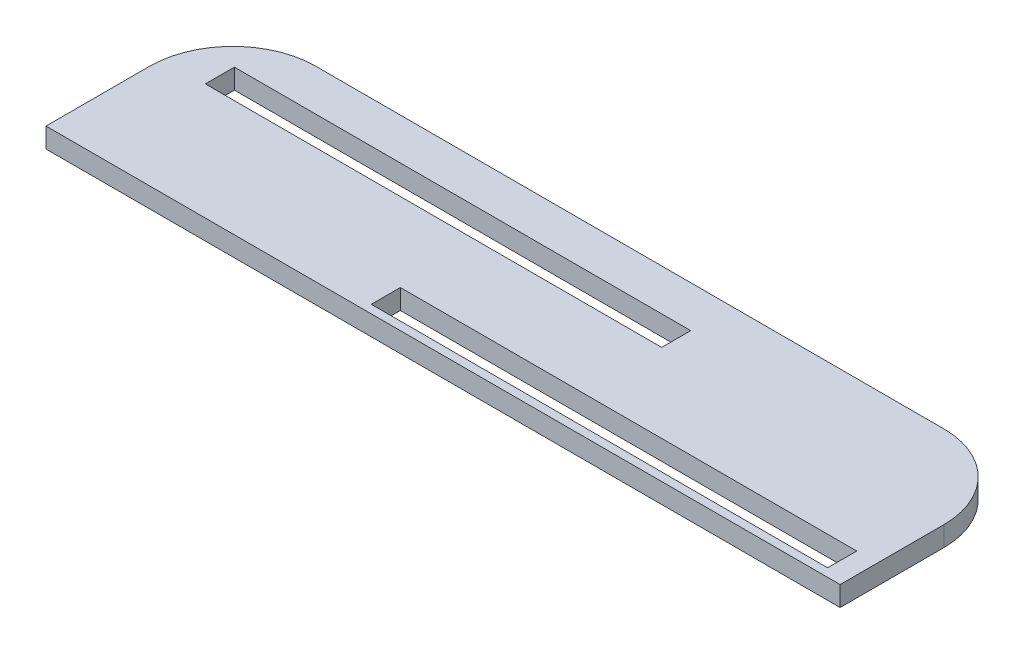
ISO-10303-21;
HEADER;
FILE_DESCRIPTION(('STEP AP214'),'2;1');
FILE_NAME('part.step','',(''),(''),'','','');
FILE_SCHEMA(('AUTOMOTIVE_DESIGN { 1 0 10303 214 1 1 1 1 }'));
ENDSEC;
DATA;
#1=APPLICATION_CONTEXT('core data for automotive mechanical design processes');
#2=APPLICATION_PROTOCOL_DEFINITION('international standard','automotive_design',2000,#1);
#3=PRODUCT_CONTEXT('',#1,'mechanical');
#4=PRODUCT('Part','Part','',(#3));
#5=PRODUCT_RELATED_PRODUCT_CATEGORY('part','',(#4));
#6=PRODUCT_DEFINITION_FORMATION('','',#4);
#7=PRODUCT_DEFINITION_CONTEXT('part definition',#1,'design');
#8=PRODUCT_DEFINITION('design','',#6,#7);
#9=PRODUCT_DEFINITION_SHAPE('','',#8);
#10=(LENGTH_UNIT() NAMED_UNIT(*) SI_UNIT(.MILLI.,.METRE.));
#11=(NAMED_UNIT(*) PLANE_ANGLE_UNIT() SI_UNIT($,.RADIAN.));
#12=(NAMED_UNIT(*) SI_UNIT($,.STERADIAN.) SOLID_ANGLE_UNIT());
#13=UNCERTAINTY_MEASURE_WITH_UNIT(LENGTH_MEASURE(1.E-05),#10,'distance_accuracy_value','');
#14=(GEOMETRIC_REPRESENTATION_CONTEXT(3) GLOBAL_UNCERTAINTY_ASSIGNED_CONTEXT((#13)) GLOBAL_UNIT_ASSIGNED_CONTEXT((#10,
#11,#12)) REPRESENTATION_CONTEXT('',''));
#15=CARTESIAN_POINT('',(0.,0.,0.));
#16=DIRECTION('',(0.,0.,1.));
#17=DIRECTION('',(1.,0.,0.));
#18=AXIS2_PLACEMENT_3D('',#15,#16,#17);
#19=CARTESIAN_POINT('',(0.,0.24,0.));
#20=DIRECTION('',(0.,-1.,0.));
#21=DIRECTION('',(0.,0.,-1.));
#22=AXIS2_PLACEMENT_3D('',#19,#20,#21);
#23=PLANE('',#22);
#24=DIRECTION('',(-1.,0.,0.));
#25=VECTOR('',#24,1.);
#26=CARTESIAN_POINT('',(6.02,0.24,-1.75));
#27=LINE('',#26,#25);
#28=CARTESIAN_POINT('',(6.02,0.24,-1.75));
#29=VERTEX_POINT('',#28);
#30=CARTESIAN_POINT('',(0.52,0.24,-1.75));
#31=VERTEX_POINT('',#30);
#32=EDGE_CURVE('E179',#29,#31,#27,.T.);
#33=ORIENTED_EDGE('',*,*,#32,.F.);
#34=DIRECTION('',(0.,0.,-1.));
#35=VECTOR('',#34,1.);
#36=CARTESIAN_POINT('',(6.02,0.24,-1.4));
#37=LINE('',#36,#35);
#38=CARTESIAN_POINT('',(6.02,0.24,-1.4));
#39=VERTEX_POINT('',#38);
#40=EDGE_CURVE('E187',#39,#29,#37,.T.);
#41=ORIENTED_EDGE('',*,*,#40,.F.);
#42=DIRECTION('',(1.,0.,0.));
#43=VECTOR('',#42,1.);
#44=CARTESIAN_POINT('',(0.52,0.24,-1.4));
#45=LINE('',#44,#43);
#46=CARTESIAN_POINT('',(0.52,0.24,-1.4));
#47=VERTEX_POINT('',#46);
#48=EDGE_CURVE('E184',#47,#39,#45,.T.);
#49=ORIENTED_EDGE('',*,*,#48,.F.);
#50=DIRECTION('',(0.,0.,1.));
#51=VECTOR('',#50,1.);
#52=CARTESIAN_POINT('',(0.52,0.24,-1.75));
#53=LINE('',#52,#51);
#54=EDGE_CURVE('E181',#31,#47,#53,.T.);
#55=ORIENTED_EDGE('',*,*,#54,.F.);
#56=EDGE_LOOP('',(#33,#41,#49,#55));
#57=FACE_BOUND('',#56,.T.);
#58=DIRECTION('',(0.,0.,-1.));
#59=VECTOR('',#58,1.);
#60=CARTESIAN_POINT('',(9.57,0.24,-2.25));
#61=LINE('',#60,#59);
#62=CARTESIAN_POINT('',(9.57,0.24,0.));
#63=VERTEX_POINT('',#62);
#64=CARTESIAN_POINT('',(9.57,0.24,-1.25));
#65=VERTEX_POINT('',#64);
#66=EDGE_CURVE('E213',#63,#65,#61,.T.);
#67=ORIENTED_EDGE('',*,*,#66,.T.);
#68=CARTESIAN_POINT('',(8.57,0.24,-1.25));
#69=DIRECTION('',(0.,-1.,0.));
#70=DIRECTION('',(0.,0.,-1.));
#71=AXIS2_PLACEMENT_3D('',#68,#69,#70);
#72=CIRCLE('',#71,1.);
#73=CARTESIAN_POINT('',(8.57,0.24,-2.25));
#74=VERTEX_POINT('',#73);
#75=EDGE_CURVE('E42',#65,#74,#72,.F.);
#76=ORIENTED_EDGE('',*,*,#75,.T.);
#77=DIRECTION('',(-1.,0.,0.));
#78=VECTOR('',#77,1.);
#79=CARTESIAN_POINT('',(0.,0.24,-2.25));
#80=LINE('',#79,#78);
#81=CARTESIAN_POINT('',(1.,0.24,-2.25));
#82=VERTEX_POINT('',#81);
#83=EDGE_CURVE('E216',#74,#82,#80,.T.);
#84=ORIENTED_EDGE('',*,*,#83,.T.);
#85=CARTESIAN_POINT('',(1.,0.24,-1.25));
#86=DIRECTION('',(0.,-1.,0.));
#87=DIRECTION('',(0.,0.,-1.));
#88=AXIS2_PLACEMENT_3D('',#85,#86,#87);
#89=CIRCLE('',#88,1.);
#90=CARTESIAN_POINT('',(0.,0.24,-1.25));
#91=VERTEX_POINT('',#90);
#92=EDGE_CURVE('E49',#82,#91,#89,.F.);
#93=ORIENTED_EDGE('',*,*,#92,.T.);
#94=DIRECTION('',(0.,0.,1.));
#95=VECTOR('',#94,1.);
#96=CARTESIAN_POINT('',(0.,0.24,0.));
#97=LINE('',#96,#95);
#98=CARTESIAN_POINT('',(0.,0.24,0.));
#99=VERTEX_POINT('',#98);
#100=EDGE_CURVE('E218',#91,#99,#97,.T.);
#101=ORIENTED_EDGE('',*,*,#100,.T.);
#102=DIRECTION('',(1.,0.,0.));
#103=VECTOR('',#102,1.);
#104=CARTESIAN_POINT('',(9.57,0.24,0.));
#105=LINE('',#104,#103);
#106=EDGE_CURVE('E210',#99,#63,#105,.T.);
#107=ORIENTED_EDGE('',*,*,#106,.T.);
#108=EDGE_LOOP('',(#67,#76,#84,#93,#101,#107));
#109=FACE_BOUND('',#108,.T.);
#110=DIRECTION('',(-1.,0.,0.));
#111=VECTOR('',#110,1.);
#112=CARTESIAN_POINT('',(9.32,0.24,-0.450000000000002));
#113=LINE('',#112,#111);
#114=CARTESIAN_POINT('',(9.32,0.24,-0.450000000000002));
#115=VERTEX_POINT('',#114);
#116=CARTESIAN_POINT('',(3.82,0.24,-0.450000000000002));
#117=VERTEX_POINT('',#116);
#118=EDGE_CURVE('E138',#115,#117,#113,.T.);
#119=ORIENTED_EDGE('',*,*,#118,.F.);
#120=DIRECTION('',(0.,0.,-1.));
#121=VECTOR('',#120,1.);
#122=CARTESIAN_POINT('',(9.32,0.24,-0.100000000000001));
#123=LINE('',#122,#121);
#124=CARTESIAN_POINT('',(9.32,0.24,-0.100000000000001));
#125=VERTEX_POINT('',#124);
#126=EDGE_CURVE('E163',#125,#115,#123,.T.);
#127=ORIENTED_EDGE('',*,*,#126,.F.);
#128=DIRECTION('',(1.,0.,0.));
#129=VECTOR('',#128,1.);
#130=CARTESIAN_POINT('',(3.82,0.24,-0.100000000000002));
#131=LINE('',#130,#129);
#132=CARTESIAN_POINT('',(3.82,0.24,-0.100000000000002));
#133=VERTEX_POINT('',#132);
#134=EDGE_CURVE('E161',#133,#125,#131,.T.);
#135=ORIENTED_EDGE('',*,*,#134,.F.);
#136=DIRECTION('',(0.,0.,1.));
#137=VECTOR('',#136,1.);
#138=CARTESIAN_POINT('',(3.82,0.24,-0.450000000000002));
#139=LINE('',#138,#137);
#140=EDGE_CURVE('E148',#117,#133,#139,.T.);
#141=ORIENTED_EDGE('',*,*,#140,.F.);
#142=EDGE_LOOP('',(#119,#127,#135,#141));
#143=FACE_BOUND('',#142,.T.);
#144=ADVANCED_FACE('F34',(#57,#109,#143),#23,.F.);
#145=CARTESIAN_POINT('',(0.,0.,0.));
#146=DIRECTION('',(0.,-1.,0.));
#147=DIRECTION('',(0.,0.,-1.));
#148=AXIS2_PLACEMENT_3D('',#145,#146,#147);
#149=PLANE('',#148);
#150=DIRECTION('',(-1.,0.,0.));
#151=VECTOR('',#150,1.);
#152=CARTESIAN_POINT('',(0.,0.,-2.25));
#153=LINE('',#152,#151);
#154=CARTESIAN_POINT('',(8.57,0.,-2.25));
#155=VERTEX_POINT('',#154);
#156=CARTESIAN_POINT('',(1.,0.,-2.25));
#157=VERTEX_POINT('',#156);
#158=EDGE_CURVE('E225',#155,#157,#153,.T.);
#159=ORIENTED_EDGE('',*,*,#158,.F.);
#160=CARTESIAN_POINT('',(8.57,0.,-1.25));
#161=DIRECTION('',(0.,-1.,0.));
#162=DIRECTION('',(0.,0.,-1.));
#163=AXIS2_PLACEMENT_3D('',#160,#161,#162);
#164=CIRCLE('',#163,1.);
#165=CARTESIAN_POINT('',(9.57,0.,-1.25));
#166=VERTEX_POINT('',#165);
#167=EDGE_CURVE('E241',#155,#166,#164,.T.);
#168=ORIENTED_EDGE('',*,*,#167,.T.);
#169=DIRECTION('',(0.,0.,-1.));
#170=VECTOR('',#169,1.);
#171=CARTESIAN_POINT('',(9.57,0.,-2.25));
#172=LINE('',#171,#170);
#173=CARTESIAN_POINT('',(9.57,0.,0.));
#174=VERTEX_POINT('',#173);
#175=EDGE_CURVE('E223',#174,#166,#172,.T.);
#176=ORIENTED_EDGE('',*,*,#175,.F.);
#177=DIRECTION('',(1.,0.,0.));
#178=VECTOR('',#177,1.);
#179=CARTESIAN_POINT('',(9.57,0.,0.));
#180=LINE('',#179,#178);
#181=CARTESIAN_POINT('',(0.,0.,0.));
#182=VERTEX_POINT('',#181);
#183=EDGE_CURVE('E209',#182,#174,#180,.T.);
#184=ORIENTED_EDGE('',*,*,#183,.F.);
#185=DIRECTION('',(0.,0.,1.));
#186=VECTOR('',#185,1.);
#187=CARTESIAN_POINT('',(0.,0.,0.));
#188=LINE('',#187,#186);
#189=CARTESIAN_POINT('',(0.,0.,-1.25));
#190=VERTEX_POINT('',#189);
#191=EDGE_CURVE('E214',#190,#182,#188,.T.);
#192=ORIENTED_EDGE('',*,*,#191,.F.);
#193=CARTESIAN_POINT('',(1.,0.,-1.25));
#194=DIRECTION('',(0.,-1.,0.));
#195=DIRECTION('',(0.,0.,-1.));
#196=AXIS2_PLACEMENT_3D('',#193,#194,#195);
#197=CIRCLE('',#196,1.);
#198=EDGE_CURVE('E239',#190,#157,#197,.T.);
#199=ORIENTED_EDGE('',*,*,#198,.T.);
#200=EDGE_LOOP('',(#159,#168,#176,#184,#192,#199));
#201=FACE_BOUND('',#200,.T.);
#202=DIRECTION('',(0.,0.,-1.));
#203=VECTOR('',#202,1.);
#204=CARTESIAN_POINT('',(6.02,0.,-1.4));
#205=LINE('',#204,#203);
#206=CARTESIAN_POINT('',(6.02,0.,-1.4));
#207=VERTEX_POINT('',#206);
#208=CARTESIAN_POINT('',(6.02,0.,-1.75));
#209=VERTEX_POINT('',#208);
#210=EDGE_CURVE('E182',#207,#209,#205,.T.);
#211=ORIENTED_EDGE('',*,*,#210,.T.);
#212=DIRECTION('',(-1.,0.,0.));
#213=VECTOR('',#212,1.);
#214=CARTESIAN_POINT('',(6.02,0.,-1.75));
#215=LINE('',#214,#213);
#216=CARTESIAN_POINT('',(0.52,0.,-1.75));
#217=VERTEX_POINT('',#216);
#218=EDGE_CURVE('E156',#209,#217,#215,.T.);
#219=ORIENTED_EDGE('',*,*,#218,.T.);
#220=DIRECTION('',(0.,0.,1.));
#221=VECTOR('',#220,1.);
#222=CARTESIAN_POINT('',(0.52,0.,-1.75));
#223=LINE('',#222,#221);
#224=CARTESIAN_POINT('',(0.52,0.,-1.4));
#225=VERTEX_POINT('',#224);
#226=EDGE_CURVE('E192',#217,#225,#223,.T.);
#227=ORIENTED_EDGE('',*,*,#226,.T.);
#228=DIRECTION('',(1.,0.,0.));
#229=VECTOR('',#228,1.);
#230=CARTESIAN_POINT('',(0.52,0.,-1.4));
#231=LINE('',#230,#229);
#232=EDGE_CURVE('E195',#225,#207,#231,.T.);
#233=ORIENTED_EDGE('',*,*,#232,.T.);
#234=EDGE_LOOP('',(#211,#219,#227,#233));
#235=FACE_BOUND('',#234,.T.);
#236=DIRECTION('',(0.,0.,-1.));
#237=VECTOR('',#236,1.);
#238=CARTESIAN_POINT('',(9.32,0.,-0.100000000000001));
#239=LINE('',#238,#237);
#240=CARTESIAN_POINT('',(9.32,0.,-0.100000000000001));
#241=VERTEX_POINT('',#240);
#242=CARTESIAN_POINT('',(9.32,0.,-0.450000000000002));
#243=VERTEX_POINT('',#242);
#244=EDGE_CURVE('E149',#241,#243,#239,.T.);
#245=ORIENTED_EDGE('',*,*,#244,.T.);
#246=DIRECTION('',(-1.,0.,0.));
#247=VECTOR('',#246,1.);
#248=CARTESIAN_POINT('',(9.32,0.,-0.450000000000002));
#249=LINE('',#248,#247);
#250=CARTESIAN_POINT('',(3.82,0.,-0.450000000000002));
#251=VERTEX_POINT('',#250);
#252=EDGE_CURVE('E167',#243,#251,#249,.T.);
#253=ORIENTED_EDGE('',*,*,#252,.T.);
#254=DIRECTION('',(0.,0.,1.));
#255=VECTOR('',#254,1.);
#256=CARTESIAN_POINT('',(3.82,0.,-0.450000000000002));
#257=LINE('',#256,#255);
#258=CARTESIAN_POINT('',(3.82,0.,-0.100000000000002));
#259=VERTEX_POINT('',#258);
#260=EDGE_CURVE('E155',#251,#259,#257,.T.);
#261=ORIENTED_EDGE('',*,*,#260,.T.);
#262=DIRECTION('',(1.,0.,0.));
#263=VECTOR('',#262,1.);
#264=CARTESIAN_POINT('',(3.82,0.,-0.100000000000002));
#265=LINE('',#264,#263);
#266=EDGE_CURVE('E170',#259,#241,#265,.T.);
#267=ORIENTED_EDGE('',*,*,#266,.T.);
#268=EDGE_LOOP('',(#245,#253,#261,#267));
#269=FACE_BOUND('',#268,.T.);
#270=ADVANCED_FACE('F254',(#201,#235,#269),#149,.T.);
#271=CARTESIAN_POINT('',(9.57,0.24,0.));
#272=DIRECTION('',(0.,0.,-1.));
#273=DIRECTION('',(-1.,0.,0.));
#274=AXIS2_PLACEMENT_3D('',#271,#272,#273);
#275=PLANE('',#274);
#276=ORIENTED_EDGE('',*,*,#183,.T.);
#277=DIRECTION('',(0.,-1.,0.));
#278=VECTOR('',#277,1.);
#279=CARTESIAN_POINT('',(9.57,0.24,0.));
#280=LINE('',#279,#278);
#281=EDGE_CURVE('E231',#63,#174,#280,.T.);
#282=ORIENTED_EDGE('',*,*,#281,.F.);
#283=ORIENTED_EDGE('',*,*,#106,.F.);
#284=DIRECTION('',(0.,-1.,0.));
#285=VECTOR('',#284,1.);
#286=CARTESIAN_POINT('',(0.,0.24,0.));
#287=LINE('',#286,#285);
#288=EDGE_CURVE('E220',#99,#182,#287,.T.);
#289=ORIENTED_EDGE('',*,*,#288,.T.);
#290=EDGE_LOOP('',(#276,#282,#283,#289));
#291=FACE_BOUND('',#290,.T.);
#292=ADVANCED_FACE('F261',(#291),#275,.F.);
#293=CARTESIAN_POINT('',(9.57,0.24,-2.25));
#294=DIRECTION('',(-1.,0.,0.));
#295=DIRECTION('',(0.,0.,1.));
#296=AXIS2_PLACEMENT_3D('',#293,#294,#295);
#297=PLANE('',#296);
#298=ORIENTED_EDGE('',*,*,#175,.T.);
#299=DIRECTION('',(0.,-1.,0.));
#300=VECTOR('',#299,1.);
#301=CARTESIAN_POINT('',(9.57,0.24,-1.25));
#302=LINE('',#301,#300);
#303=EDGE_CURVE('E57',#166,#65,#302,.F.);
#304=ORIENTED_EDGE('',*,*,#303,.T.);
#305=ORIENTED_EDGE('',*,*,#66,.F.);
#306=ORIENTED_EDGE('',*,*,#281,.T.);
#307=EDGE_LOOP('',(#298,#304,#305,#306));
#308=FACE_BOUND('',#307,.T.);
#309=ADVANCED_FACE('F257',(#308),#297,.F.);
#310=CARTESIAN_POINT('',(0.,0.24,-2.25));
#311=DIRECTION('',(0.,0.,1.));
#312=DIRECTION('',(1.,0.,0.));
#313=AXIS2_PLACEMENT_3D('',#310,#311,#312);
#314=PLANE('',#313);
#315=ORIENTED_EDGE('',*,*,#83,.F.);
#316=DIRECTION('',(0.,-1.,0.));
#317=VECTOR('',#316,1.);
#318=CARTESIAN_POINT('',(8.57,0.24,-2.25));
#319=LINE('',#318,#317);
#320=EDGE_CURVE('E236',#74,#155,#319,.T.);
#321=ORIENTED_EDGE('',*,*,#320,.T.);
#322=ORIENTED_EDGE('',*,*,#158,.T.);
#323=DIRECTION('',(0.,-1.,0.));
#324=VECTOR('',#323,1.);
#325=CARTESIAN_POINT('',(1.,0.24,-2.25));
#326=LINE('',#325,#324);
#327=EDGE_CURVE('E234',#157,#82,#326,.F.);
#328=ORIENTED_EDGE('',*,*,#327,.T.);
#329=EDGE_LOOP('',(#315,#321,#322,#328));
#330=FACE_BOUND('',#329,.T.);
#331=ADVANCED_FACE('F249',(#330),#314,.F.);
#332=CARTESIAN_POINT('',(0.,0.24,0.));
#333=DIRECTION('',(1.,0.,0.));
#334=DIRECTION('',(0.,0.,-1.));
#335=AXIS2_PLACEMENT_3D('',#332,#333,#334);
#336=PLANE('',#335);
#337=ORIENTED_EDGE('',*,*,#100,.F.);
#338=DIRECTION('',(0.,-1.,0.));
#339=VECTOR('',#338,1.);
#340=CARTESIAN_POINT('',(0.,0.24,-1.25));
#341=LINE('',#340,#339);
#342=EDGE_CURVE('E11',#91,#190,#341,.T.);
#343=ORIENTED_EDGE('',*,*,#342,.T.);
#344=ORIENTED_EDGE('',*,*,#191,.T.);
#345=ORIENTED_EDGE('',*,*,#288,.F.);
#346=EDGE_LOOP('',(#337,#343,#344,#345));
#347=FACE_BOUND('',#346,.T.);
#348=ADVANCED_FACE('F265',(#347),#336,.F.);
#349=CARTESIAN_POINT('',(6.02,0.24,-1.75));
#350=DIRECTION('',(0.,0.,1.));
#351=DIRECTION('',(1.,0.,0.));
#352=AXIS2_PLACEMENT_3D('',#349,#350,#351);
#353=PLANE('',#352);
#354=ORIENTED_EDGE('',*,*,#218,.F.);
#355=DIRECTION('',(0.,-1.,0.));
#356=VECTOR('',#355,1.);
#357=CARTESIAN_POINT('',(6.02,0.24,-1.75));
#358=LINE('',#357,#356);
#359=EDGE_CURVE('E189',#29,#209,#358,.T.);
#360=ORIENTED_EDGE('',*,*,#359,.F.);
#361=ORIENTED_EDGE('',*,*,#32,.T.);
#362=DIRECTION('',(0.,-1.,0.));
#363=VECTOR('',#362,1.);
#364=CARTESIAN_POINT('',(0.52,0.24,-1.75));
#365=LINE('',#364,#363);
#366=EDGE_CURVE('E206',#31,#217,#365,.T.);
#367=ORIENTED_EDGE('',*,*,#366,.T.);
#368=EDGE_LOOP('',(#354,#360,#361,#367));
#369=FACE_BOUND('',#368,.T.);
#370=ADVANCED_FACE('F282',(#369),#353,.T.);
#371=CARTESIAN_POINT('',(0.52,0.24,-1.75));
#372=DIRECTION('',(1.,0.,0.));
#373=DIRECTION('',(0.,0.,-1.));
#374=AXIS2_PLACEMENT_3D('',#371,#372,#373);
#375=PLANE('',#374);
#376=ORIENTED_EDGE('',*,*,#226,.F.);
#377=ORIENTED_EDGE('',*,*,#366,.F.);
#378=ORIENTED_EDGE('',*,*,#54,.T.);
#379=DIRECTION('',(0.,-1.,0.));
#380=VECTOR('',#379,1.);
#381=CARTESIAN_POINT('',(0.52,0.24,-1.4));
#382=LINE('',#381,#380);
#383=EDGE_CURVE('E204',#47,#225,#382,.T.);
#384=ORIENTED_EDGE('',*,*,#383,.T.);
#385=EDGE_LOOP('',(#376,#377,#378,#384));
#386=FACE_BOUND('',#385,.T.);
#387=ADVANCED_FACE('F315',(#386),#375,.T.);
#388=CARTESIAN_POINT('',(0.52,0.24,-1.4));
#389=DIRECTION('',(0.,0.,-1.));
#390=DIRECTION('',(-1.,0.,0.));
#391=AXIS2_PLACEMENT_3D('',#388,#389,#390);
#392=PLANE('',#391);
#393=ORIENTED_EDGE('',*,*,#232,.F.);
#394=ORIENTED_EDGE('',*,*,#383,.F.);
#395=ORIENTED_EDGE('',*,*,#48,.T.);
#396=DIRECTION('',(0.,-1.,0.));
#397=VECTOR('',#396,1.);
#398=CARTESIAN_POINT('',(6.02,0.24,-1.4));
#399=LINE('',#398,#397);
#400=EDGE_CURVE('E202',#39,#207,#399,.T.);
#401=ORIENTED_EDGE('',*,*,#400,.T.);
#402=EDGE_LOOP('',(#393,#394,#395,#401));
#403=FACE_BOUND('',#402,.T.);
#404=ADVANCED_FACE('F322',(#403),#392,.T.);
#405=CARTESIAN_POINT('',(6.02,0.24,-1.4));
#406=DIRECTION('',(-1.,0.,0.));
#407=DIRECTION('',(0.,0.,1.));
#408=AXIS2_PLACEMENT_3D('',#405,#406,#407);
#409=PLANE('',#408);
#410=ORIENTED_EDGE('',*,*,#210,.F.);
#411=ORIENTED_EDGE('',*,*,#400,.F.);
#412=ORIENTED_EDGE('',*,*,#40,.T.);
#413=ORIENTED_EDGE('',*,*,#359,.T.);
#414=EDGE_LOOP('',(#410,#411,#412,#413));
#415=FACE_BOUND('',#414,.T.);
#416=ADVANCED_FACE('F329',(#415),#409,.T.);
#417=CARTESIAN_POINT('',(9.32,0.24,-0.450000000000002));
#418=DIRECTION('',(0.,0.,1.));
#419=DIRECTION('',(1.,0.,0.));
#420=AXIS2_PLACEMENT_3D('',#417,#418,#419);
#421=PLANE('',#420);
#422=ORIENTED_EDGE('',*,*,#252,.F.);
#423=DIRECTION('',(0.,-1.,0.));
#424=VECTOR('',#423,1.);
#425=CARTESIAN_POINT('',(9.32,0.24,-0.450000000000002));
#426=LINE('',#425,#424);
#427=EDGE_CURVE('E144',#115,#243,#426,.T.);
#428=ORIENTED_EDGE('',*,*,#427,.F.);
#429=ORIENTED_EDGE('',*,*,#118,.T.);
#430=DIRECTION('',(0.,-1.,0.));
#431=VECTOR('',#430,1.);
#432=CARTESIAN_POINT('',(3.82,0.24,-0.450000000000002));
#433=LINE('',#432,#431);
#434=EDGE_CURVE('E141',#117,#251,#433,.T.);
#435=ORIENTED_EDGE('',*,*,#434,.T.);
#436=EDGE_LOOP('',(#422,#428,#429,#435));
#437=FACE_BOUND('',#436,.T.);
#438=ADVANCED_FACE('F140',(#437),#421,.T.);
#439=CARTESIAN_POINT('',(3.82,0.24,-0.450000000000002));
#440=DIRECTION('',(1.,0.,0.));
#441=DIRECTION('',(0.,0.,-1.));
#442=AXIS2_PLACEMENT_3D('',#439,#440,#441);
#443=PLANE('',#442);
#444=ORIENTED_EDGE('',*,*,#260,.F.);
#445=ORIENTED_EDGE('',*,*,#434,.F.);
#446=ORIENTED_EDGE('',*,*,#140,.T.);
#447=DIRECTION('',(0.,-1.,0.));
#448=VECTOR('',#447,1.);
#449=CARTESIAN_POINT('',(3.82,0.24,-0.100000000000002));
#450=LINE('',#449,#448);
#451=EDGE_CURVE('E157',#133,#259,#450,.T.);
#452=ORIENTED_EDGE('',*,*,#451,.T.);
#453=EDGE_LOOP('',(#444,#445,#446,#452));
#454=FACE_BOUND('',#453,.T.);
#455=ADVANCED_FACE('F152',(#454),#443,.T.);
#456=CARTESIAN_POINT('',(3.82,0.24,-0.100000000000002));
#457=DIRECTION('',(0.,0.,-1.));
#458=DIRECTION('',(-1.,0.,0.));
#459=AXIS2_PLACEMENT_3D('',#456,#457,#458);
#460=PLANE('',#459);
#461=ORIENTED_EDGE('',*,*,#266,.F.);
#462=ORIENTED_EDGE('',*,*,#451,.F.);
#463=ORIENTED_EDGE('',*,*,#134,.T.);
#464=DIRECTION('',(0.,-1.,0.));
#465=VECTOR('',#464,1.);
#466=CARTESIAN_POINT('',(9.32,0.24,-0.100000000000001));
#467=LINE('',#466,#465);
#468=EDGE_CURVE('E176',#125,#241,#467,.T.);
#469=ORIENTED_EDGE('',*,*,#468,.T.);
#470=EDGE_LOOP('',(#461,#462,#463,#469));
#471=FACE_BOUND('',#470,.T.);
#472=ADVANCED_FACE('F350',(#471),#460,.T.);
#473=CARTESIAN_POINT('',(9.32,0.24,-0.100000000000001));
#474=DIRECTION('',(-1.,0.,0.));
#475=DIRECTION('',(0.,0.,1.));
#476=AXIS2_PLACEMENT_3D('',#473,#474,#475);
#477=PLANE('',#476);
#478=ORIENTED_EDGE('',*,*,#244,.F.);
#479=ORIENTED_EDGE('',*,*,#468,.F.);
#480=ORIENTED_EDGE('',*,*,#126,.T.);
#481=ORIENTED_EDGE('',*,*,#427,.T.);
#482=EDGE_LOOP('',(#478,#479,#480,#481));
#483=FACE_BOUND('',#482,.T.);
#484=ADVANCED_FACE('F272',(#483),#477,.T.);
#485=CARTESIAN_POINT('',(8.57,0.24,-1.25));
#486=DIRECTION('',(0.,-1.,0.));
#487=DIRECTION('',(0.,0.,-1.));
#488=AXIS2_PLACEMENT_3D('',#485,#486,#487);
#489=CYLINDRICAL_SURFACE('',#488,1.);
#490=ORIENTED_EDGE('',*,*,#75,.F.);
#491=ORIENTED_EDGE('',*,*,#303,.F.);
#492=ORIENTED_EDGE('',*,*,#167,.F.);
#493=ORIENTED_EDGE('',*,*,#320,.F.);
#494=EDGE_LOOP('',(#490,#491,#492,#493));
#495=FACE_BOUND('',#494,.T.);
#496=ADVANCED_FACE('F252',(#495),#489,.T.);
#497=CARTESIAN_POINT('',(1.,0.24,-1.25));
#498=DIRECTION('',(0.,-1.,0.));
#499=DIRECTION('',(0.,0.,-1.));
#500=AXIS2_PLACEMENT_3D('',#497,#498,#499);
#501=CYLINDRICAL_SURFACE('',#500,1.);
#502=ORIENTED_EDGE('',*,*,#92,.F.);
#503=ORIENTED_EDGE('',*,*,#327,.F.);
#504=ORIENTED_EDGE('',*,*,#198,.F.);
#505=ORIENTED_EDGE('',*,*,#342,.F.);
#506=EDGE_LOOP('',(#502,#503,#504,#505));
#507=FACE_BOUND('',#506,.T.);
#508=ADVANCED_FACE('F36',(#507),#501,.T.);
#509=CLOSED_SHELL('',(#144,#270,#292,#309,#331,#348,#370,#387,#404,#416,#438,#455,#472,#484,
#496,#508));
#510=MANIFOLD_SOLID_BREP('B2',#509);
#511=ADVANCED_BREP_SHAPE_REPRESENTATION('',(#18,#510),#14);
#512=SHAPE_DEFINITION_REPRESENTATION(#9,#511);
ENDSEC;
END-ISO-10303-21;
